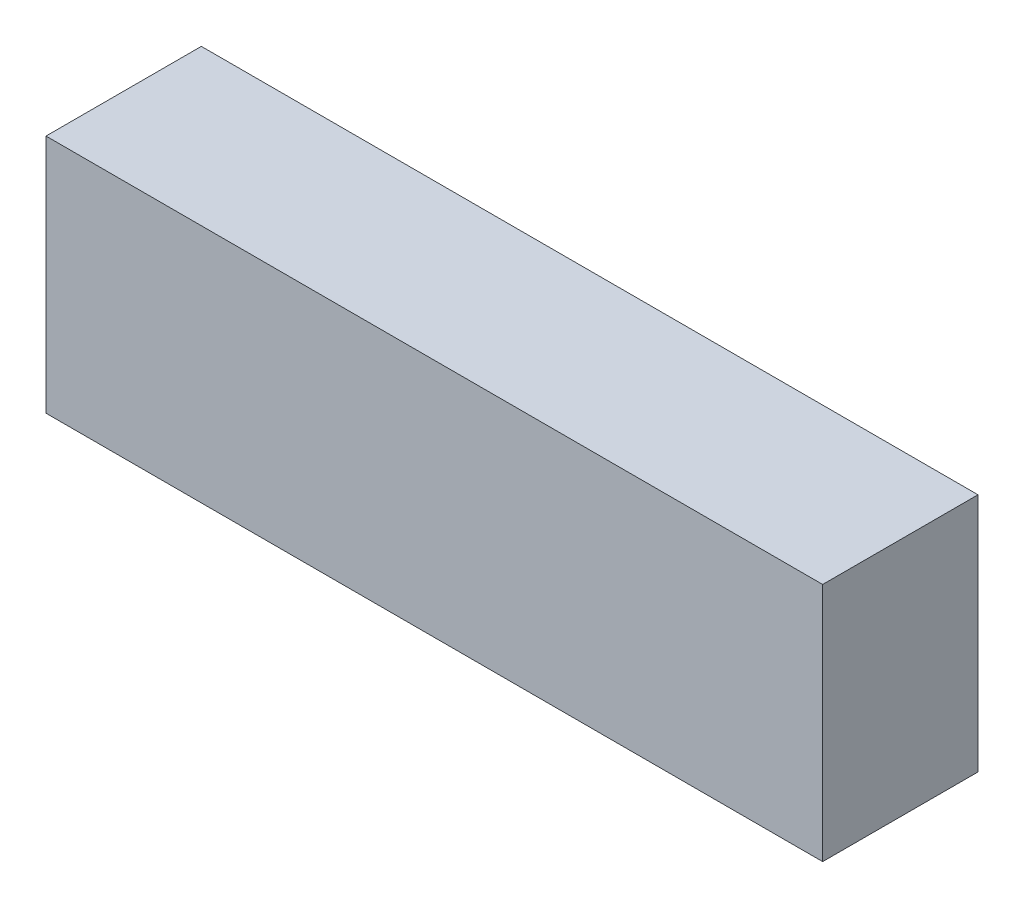
ISO-10303-21;
HEADER;
FILE_DESCRIPTION(('STEP AP214'),'2;1');
FILE_NAME('part.step','',(''),(''),'','','');
FILE_SCHEMA(('AUTOMOTIVE_DESIGN { 1 0 10303 214 1 1 1 1 }'));
ENDSEC;
DATA;
#1=APPLICATION_CONTEXT('core data for automotive mechanical design processes');
#2=APPLICATION_PROTOCOL_DEFINITION('international standard','automotive_design',2000,#1);
#3=PRODUCT_CONTEXT('',#1,'mechanical');
#4=PRODUCT('Part','Part','',(#3));
#5=PRODUCT_RELATED_PRODUCT_CATEGORY('part','',(#4));
#6=PRODUCT_DEFINITION_FORMATION('','',#4);
#7=PRODUCT_DEFINITION_CONTEXT('part definition',#1,'design');
#8=PRODUCT_DEFINITION('design','',#6,#7);
#9=PRODUCT_DEFINITION_SHAPE('','',#8);
#10=(LENGTH_UNIT() NAMED_UNIT(*) SI_UNIT(.MILLI.,.METRE.));
#11=(NAMED_UNIT(*) PLANE_ANGLE_UNIT() SI_UNIT($,.RADIAN.));
#12=(NAMED_UNIT(*) SI_UNIT($,.STERADIAN.) SOLID_ANGLE_UNIT());
#13=UNCERTAINTY_MEASURE_WITH_UNIT(LENGTH_MEASURE(1.E-05),#10,'distance_accuracy_value','');
#14=(GEOMETRIC_REPRESENTATION_CONTEXT(3) GLOBAL_UNCERTAINTY_ASSIGNED_CONTEXT((#13)) GLOBAL_UNIT_ASSIGNED_CONTEXT((#10,
#11,#12)) REPRESENTATION_CONTEXT('',''));
#15=CARTESIAN_POINT('',(0.,0.,0.));
#16=DIRECTION('',(0.,0.,1.));
#17=DIRECTION('',(1.,0.,0.));
#18=AXIS2_PLACEMENT_3D('',#15,#16,#17);
#19=CARTESIAN_POINT('',(55.,-17.,22.));
#20=DIRECTION('',(-1.,0.,0.));
#21=DIRECTION('',(0.,0.,1.));
#22=AXIS2_PLACEMENT_3D('',#19,#20,#21);
#23=PLANE('',#22);
#24=DIRECTION('',(0.,1.,0.));
#25=VECTOR('',#24,1.);
#26=CARTESIAN_POINT('',(55.,-17.,0.));
#27=LINE('',#26,#25);
#28=CARTESIAN_POINT('',(55.,-17.,0.));
#29=VERTEX_POINT('',#28);
#30=CARTESIAN_POINT('',(55.,17.,0.));
#31=VERTEX_POINT('',#30);
#32=EDGE_CURVE('E100',#29,#31,#27,.T.);
#33=ORIENTED_EDGE('',*,*,#32,.T.);
#34=DIRECTION('',(0.,0.,-1.));
#35=VECTOR('',#34,1.);
#36=CARTESIAN_POINT('',(55.,17.,22.));
#37=LINE('',#36,#35);
#38=CARTESIAN_POINT('',(55.,17.,22.));
#39=VERTEX_POINT('',#38);
#40=EDGE_CURVE('E11',#39,#31,#37,.T.);
#41=ORIENTED_EDGE('',*,*,#40,.F.);
#42=DIRECTION('',(0.,1.,0.));
#43=VECTOR('',#42,1.);
#44=CARTESIAN_POINT('',(55.,-17.,22.));
#45=LINE('',#44,#43);
#46=CARTESIAN_POINT('',(55.,-17.,22.));
#47=VERTEX_POINT('',#46);
#48=EDGE_CURVE('E88',#47,#39,#45,.T.);
#49=ORIENTED_EDGE('',*,*,#48,.F.);
#50=DIRECTION('',(0.,0.,-1.));
#51=VECTOR('',#50,1.);
#52=CARTESIAN_POINT('',(55.,-17.,22.));
#53=LINE('',#52,#51);
#54=EDGE_CURVE('E96',#47,#29,#53,.T.);
#55=ORIENTED_EDGE('',*,*,#54,.T.);
#56=EDGE_LOOP('',(#33,#41,#49,#55));
#57=FACE_BOUND('',#56,.T.);
#58=ADVANCED_FACE('F37',(#57),#23,.F.);
#59=CARTESIAN_POINT('',(-55.,17.,22.));
#60=DIRECTION('',(0.,-1.,0.));
#61=DIRECTION('',(0.,0.,-1.));
#62=AXIS2_PLACEMENT_3D('',#59,#60,#61);
#63=PLANE('',#62);
#64=DIRECTION('',(-1.,0.,0.));
#65=VECTOR('',#64,1.);
#66=CARTESIAN_POINT('',(-55.,17.,0.));
#67=LINE('',#66,#65);
#68=CARTESIAN_POINT('',(-55.,17.,0.));
#69=VERTEX_POINT('',#68);
#70=EDGE_CURVE('E92',#31,#69,#67,.T.);
#71=ORIENTED_EDGE('',*,*,#70,.T.);
#72=DIRECTION('',(0.,0.,-1.));
#73=VECTOR('',#72,1.);
#74=CARTESIAN_POINT('',(-55.,17.,22.));
#75=LINE('',#74,#73);
#76=CARTESIAN_POINT('',(-55.,17.,22.));
#77=VERTEX_POINT('',#76);
#78=EDGE_CURVE('E45',#77,#69,#75,.T.);
#79=ORIENTED_EDGE('',*,*,#78,.F.);
#80=DIRECTION('',(-1.,0.,0.));
#81=VECTOR('',#80,1.);
#82=CARTESIAN_POINT('',(-55.,17.,22.));
#83=LINE('',#82,#81);
#84=EDGE_CURVE('E83',#39,#77,#83,.T.);
#85=ORIENTED_EDGE('',*,*,#84,.F.);
#86=ORIENTED_EDGE('',*,*,#40,.T.);
#87=EDGE_LOOP('',(#71,#79,#85,#86));
#88=FACE_BOUND('',#87,.T.);
#89=ADVANCED_FACE('F91',(#88),#63,.F.);
#90=CARTESIAN_POINT('',(-55.,-17.,22.));
#91=DIRECTION('',(1.,0.,0.));
#92=DIRECTION('',(0.,0.,-1.));
#93=AXIS2_PLACEMENT_3D('',#90,#91,#92);
#94=PLANE('',#93);
#95=DIRECTION('',(0.,-1.,0.));
#96=VECTOR('',#95,1.);
#97=CARTESIAN_POINT('',(-55.,-17.,0.));
#98=LINE('',#97,#96);
#99=CARTESIAN_POINT('',(-55.,-17.,0.));
#100=VERTEX_POINT('',#99);
#101=EDGE_CURVE('E70',#69,#100,#98,.T.);
#102=ORIENTED_EDGE('',*,*,#101,.T.);
#103=DIRECTION('',(0.,0.,-1.));
#104=VECTOR('',#103,1.);
#105=CARTESIAN_POINT('',(-55.,-17.,22.));
#106=LINE('',#105,#104);
#107=CARTESIAN_POINT('',(-55.,-17.,22.));
#108=VERTEX_POINT('',#107);
#109=EDGE_CURVE('E93',#108,#100,#106,.T.);
#110=ORIENTED_EDGE('',*,*,#109,.F.);
#111=DIRECTION('',(0.,-1.,0.));
#112=VECTOR('',#111,1.);
#113=CARTESIAN_POINT('',(-55.,-17.,22.));
#114=LINE('',#113,#112);
#115=EDGE_CURVE('E86',#77,#108,#114,.T.);
#116=ORIENTED_EDGE('',*,*,#115,.F.);
#117=ORIENTED_EDGE('',*,*,#78,.T.);
#118=EDGE_LOOP('',(#102,#110,#116,#117));
#119=FACE_BOUND('',#118,.T.);
#120=ADVANCED_FACE('F94',(#119),#94,.F.);
#121=CARTESIAN_POINT('',(-55.,-17.,22.));
#122=DIRECTION('',(0.,1.,0.));
#123=DIRECTION('',(0.,0.,1.));
#124=AXIS2_PLACEMENT_3D('',#121,#122,#123);
#125=PLANE('',#124);
#126=DIRECTION('',(1.,0.,0.));
#127=VECTOR('',#126,1.);
#128=CARTESIAN_POINT('',(-55.,-17.,0.));
#129=LINE('',#128,#127);
#130=EDGE_CURVE('E76',#100,#29,#129,.T.);
#131=ORIENTED_EDGE('',*,*,#130,.T.);
#132=ORIENTED_EDGE('',*,*,#54,.F.);
#133=DIRECTION('',(1.,0.,0.));
#134=VECTOR('',#133,1.);
#135=CARTESIAN_POINT('',(-55.,-17.,22.));
#136=LINE('',#135,#134);
#137=EDGE_CURVE('E53',#108,#47,#136,.T.);
#138=ORIENTED_EDGE('',*,*,#137,.F.);
#139=ORIENTED_EDGE('',*,*,#109,.T.);
#140=EDGE_LOOP('',(#131,#132,#138,#139));
#141=FACE_BOUND('',#140,.T.);
#142=ADVANCED_FACE('F107',(#141),#125,.F.);
#143=CARTESIAN_POINT('',(0.,0.,22.));
#144=DIRECTION('',(0.,0.,-1.));
#145=DIRECTION('',(-1.,0.,0.));
#146=AXIS2_PLACEMENT_3D('',#143,#144,#145);
#147=PLANE('',#146);
#148=ORIENTED_EDGE('',*,*,#48,.T.);
#149=ORIENTED_EDGE('',*,*,#84,.T.);
#150=ORIENTED_EDGE('',*,*,#115,.T.);
#151=ORIENTED_EDGE('',*,*,#137,.T.);
#152=EDGE_LOOP('',(#148,#149,#150,#151));
#153=FACE_BOUND('',#152,.T.);
#154=ADVANCED_FACE('F84',(#153),#147,.F.);
#155=CARTESIAN_POINT('',(0.,0.,0.));
#156=DIRECTION('',(0.,0.,-1.));
#157=DIRECTION('',(-1.,0.,0.));
#158=AXIS2_PLACEMENT_3D('',#155,#156,#157);
#159=PLANE('',#158);
#160=ORIENTED_EDGE('',*,*,#32,.F.);
#161=ORIENTED_EDGE('',*,*,#130,.F.);
#162=ORIENTED_EDGE('',*,*,#101,.F.);
#163=ORIENTED_EDGE('',*,*,#70,.F.);
#164=EDGE_LOOP('',(#160,#161,#162,#163));
#165=FACE_BOUND('',#164,.T.);
#166=ADVANCED_FACE('F110',(#165),#159,.T.);
#167=CLOSED_SHELL('',(#58,#89,#120,#142,#154,#166));
#168=MANIFOLD_SOLID_BREP('B2',#167);
#169=ADVANCED_BREP_SHAPE_REPRESENTATION('',(#18,#168),#14);
#170=SHAPE_DEFINITION_REPRESENTATION(#9,#169);
ENDSEC;
END-ISO-10303-21;
